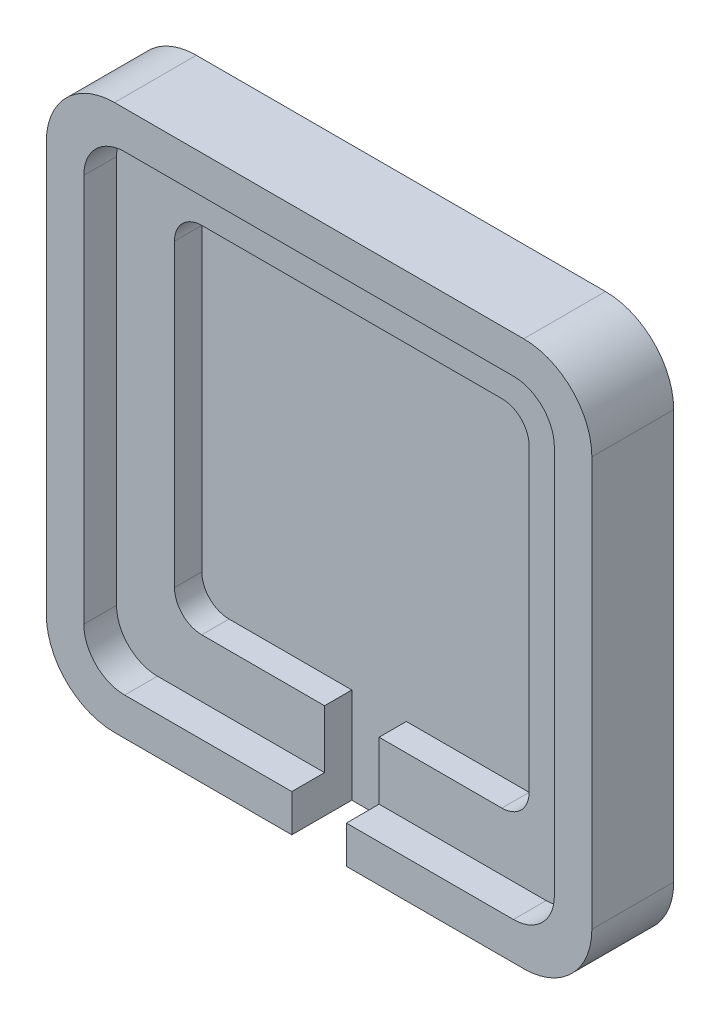
ISO-10303-21;
HEADER;
FILE_DESCRIPTION(('STEP AP214'),'2;1');
FILE_NAME('part.step','',(''),(''),'','','');
FILE_SCHEMA(('AUTOMOTIVE_DESIGN { 1 0 10303 214 1 1 1 1 }'));
ENDSEC;
DATA;
#1=APPLICATION_CONTEXT('core data for automotive mechanical design processes');
#2=APPLICATION_PROTOCOL_DEFINITION('international standard','automotive_design',2000,#1);
#3=PRODUCT_CONTEXT('',#1,'mechanical');
#4=PRODUCT('Part','Part','',(#3));
#5=PRODUCT_RELATED_PRODUCT_CATEGORY('part','',(#4));
#6=PRODUCT_DEFINITION_FORMATION('','',#4);
#7=PRODUCT_DEFINITION_CONTEXT('part definition',#1,'design');
#8=PRODUCT_DEFINITION('design','',#6,#7);
#9=PRODUCT_DEFINITION_SHAPE('','',#8);
#10=(LENGTH_UNIT() NAMED_UNIT(*) SI_UNIT(.MILLI.,.METRE.));
#11=(NAMED_UNIT(*) PLANE_ANGLE_UNIT() SI_UNIT($,.RADIAN.));
#12=(NAMED_UNIT(*) SI_UNIT($,.STERADIAN.) SOLID_ANGLE_UNIT());
#13=UNCERTAINTY_MEASURE_WITH_UNIT(LENGTH_MEASURE(1.E-05),#10,'distance_accuracy_value','');
#14=(GEOMETRIC_REPRESENTATION_CONTEXT(3) GLOBAL_UNCERTAINTY_ASSIGNED_CONTEXT((#13)) GLOBAL_UNIT_ASSIGNED_CONTEXT((#10,
#11,#12)) REPRESENTATION_CONTEXT('',''));
#15=CARTESIAN_POINT('',(0.,0.,0.));
#16=DIRECTION('',(0.,0.,1.));
#17=DIRECTION('',(1.,0.,0.));
#18=AXIS2_PLACEMENT_3D('',#15,#16,#17);
#19=CARTESIAN_POINT('',(17.25,-17.25,3.6));
#20=DIRECTION('',(0.,-1.,0.));
#21=DIRECTION('',(1.,0.,0.));
#22=AXIS2_PLACEMENT_3D('',#19,#20,#21);
#23=PLANE('',#22);
#24=DIRECTION('',(1.,0.,0.));
#25=VECTOR('',#24,1.);
#26=CARTESIAN_POINT('',(17.25,-17.25,3.6));
#27=LINE('',#26,#25);
#28=CARTESIAN_POINT('',(2.,-17.25,3.6));
#29=VERTEX_POINT('',#28);
#30=CARTESIAN_POINT('',(14.25,-17.25,3.6));
#31=VERTEX_POINT('',#30);
#32=EDGE_CURVE('E285',#29,#31,#27,.T.);
#33=ORIENTED_EDGE('',*,*,#32,.F.);
#34=DIRECTION('',(0.,0.,1.));
#35=VECTOR('',#34,1.);
#36=CARTESIAN_POINT('',(2.,-17.25,3.6));
#37=LINE('',#36,#35);
#38=CARTESIAN_POINT('',(2.,-17.25,6.));
#39=VERTEX_POINT('',#38);
#40=EDGE_CURVE('E258',#29,#39,#37,.T.);
#41=ORIENTED_EDGE('',*,*,#40,.T.);
#42=DIRECTION('',(1.,0.,0.));
#43=VECTOR('',#42,1.);
#44=CARTESIAN_POINT('',(17.25,-17.25,6.));
#45=LINE('',#44,#43);
#46=CARTESIAN_POINT('',(14.25,-17.25,6.));
#47=VERTEX_POINT('',#46);
#48=EDGE_CURVE('E299',#39,#47,#45,.T.);
#49=ORIENTED_EDGE('',*,*,#48,.T.);
#50=DIRECTION('',(0.,0.,1.));
#51=VECTOR('',#50,1.);
#52=CARTESIAN_POINT('',(14.25,-17.25,3.6));
#53=LINE('',#52,#51);
#54=EDGE_CURVE('E389',#47,#31,#53,.F.);
#55=ORIENTED_EDGE('',*,*,#54,.T.);
#56=EDGE_LOOP('',(#33,#41,#49,#55));
#57=FACE_BOUND('',#56,.T.);
#58=ADVANCED_FACE('F33',(#57),#23,.F.);
#59=CARTESIAN_POINT('',(-13.,-13.,1.6));
#60=DIRECTION('',(0.,-1.,0.));
#61=DIRECTION('',(0.,0.,-1.));
#62=AXIS2_PLACEMENT_3D('',#59,#60,#61);
#63=PLANE('',#62);
#64=DIRECTION('',(1.,0.,0.));
#65=VECTOR('',#64,1.);
#66=CARTESIAN_POINT('',(-13.,-13.,1.6));
#67=LINE('',#66,#65);
#68=CARTESIAN_POINT('',(2.,-13.,1.6));
#69=VERTEX_POINT('',#68);
#70=CARTESIAN_POINT('',(11.,-13.,1.6));
#71=VERTEX_POINT('',#70);
#72=EDGE_CURVE('E272',#69,#71,#67,.T.);
#73=ORIENTED_EDGE('',*,*,#72,.F.);
#74=DIRECTION('',(0.,0.,1.));
#75=VECTOR('',#74,1.);
#76=CARTESIAN_POINT('',(2.,-13.,1.6));
#77=LINE('',#76,#75);
#78=CARTESIAN_POINT('',(2.,-13.,3.6));
#79=VERTEX_POINT('',#78);
#80=EDGE_CURVE('E235',#69,#79,#77,.T.);
#81=ORIENTED_EDGE('',*,*,#80,.T.);
#82=DIRECTION('',(1.,0.,0.));
#83=VECTOR('',#82,1.);
#84=CARTESIAN_POINT('',(-13.,-13.,3.6));
#85=LINE('',#84,#83);
#86=CARTESIAN_POINT('',(11.,-13.,3.6));
#87=VERTEX_POINT('',#86);
#88=EDGE_CURVE('E279',#79,#87,#85,.T.);
#89=ORIENTED_EDGE('',*,*,#88,.T.);
#90=DIRECTION('',(0.,0.,1.));
#91=VECTOR('',#90,1.);
#92=CARTESIAN_POINT('',(11.,-13.,1.6));
#93=LINE('',#92,#91);
#94=EDGE_CURVE('E414',#87,#71,#93,.F.);
#95=ORIENTED_EDGE('',*,*,#94,.T.);
#96=EDGE_LOOP('',(#73,#81,#89,#95));
#97=FACE_BOUND('',#96,.T.);
#98=ADVANCED_FACE('F513',(#97),#63,.F.);
#99=CARTESIAN_POINT('',(-20.,-20.,6.));
#100=DIRECTION('',(1.,0.,0.));
#101=DIRECTION('',(0.,0.,-1.));
#102=AXIS2_PLACEMENT_3D('',#99,#100,#101);
#103=PLANE('',#102);
#104=DIRECTION('',(0.,-1.,0.));
#105=VECTOR('',#104,1.);
#106=CARTESIAN_POINT('',(-20.,-20.,0.));
#107=LINE('',#106,#105);
#108=CARTESIAN_POINT('',(-20.,15.,0.));
#109=VERTEX_POINT('',#108);
#110=CARTESIAN_POINT('',(-20.,-15.,0.));
#111=VERTEX_POINT('',#110);
#112=EDGE_CURVE('E296',#109,#111,#107,.T.);
#113=ORIENTED_EDGE('',*,*,#112,.T.);
#114=DIRECTION('',(0.,0.,-1.));
#115=VECTOR('',#114,1.);
#116=CARTESIAN_POINT('',(-20.,-15.,6.));
#117=LINE('',#116,#115);
#118=CARTESIAN_POINT('',(-20.,-15.,6.));
#119=VERTEX_POINT('',#118);
#120=EDGE_CURVE('E348',#111,#119,#117,.F.);
#121=ORIENTED_EDGE('',*,*,#120,.T.);
#122=DIRECTION('',(0.,-1.,0.));
#123=VECTOR('',#122,1.);
#124=CARTESIAN_POINT('',(-20.,-20.,6.));
#125=LINE('',#124,#123);
#126=CARTESIAN_POINT('',(-20.,15.,6.));
#127=VERTEX_POINT('',#126);
#128=EDGE_CURVE('E308',#127,#119,#125,.T.);
#129=ORIENTED_EDGE('',*,*,#128,.F.);
#130=DIRECTION('',(0.,0.,-1.));
#131=VECTOR('',#130,1.);
#132=CARTESIAN_POINT('',(-20.,15.,6.));
#133=LINE('',#132,#131);
#134=EDGE_CURVE('E345',#127,#109,#133,.T.);
#135=ORIENTED_EDGE('',*,*,#134,.T.);
#136=EDGE_LOOP('',(#113,#121,#129,#135));
#137=FACE_BOUND('',#136,.T.);
#138=ADVANCED_FACE('F547',(#137),#103,.F.);
#139=CARTESIAN_POINT('',(20.,-20.,6.));
#140=DIRECTION('',(0.,1.,0.));
#141=DIRECTION('',(-1.,0.,0.));
#142=AXIS2_PLACEMENT_3D('',#139,#140,#141);
#143=PLANE('',#142);
#144=DIRECTION('',(1.,0.,0.));
#145=VECTOR('',#144,1.);
#146=CARTESIAN_POINT('',(20.,-20.,6.));
#147=LINE('',#146,#145);
#148=CARTESIAN_POINT('',(2.,-20.,6.));
#149=VERTEX_POINT('',#148);
#150=CARTESIAN_POINT('',(15.,-20.,6.));
#151=VERTEX_POINT('',#150);
#152=EDGE_CURVE('E311',#149,#151,#147,.T.);
#153=ORIENTED_EDGE('',*,*,#152,.F.);
#154=DIRECTION('',(0.,0.,-1.));
#155=VECTOR('',#154,1.);
#156=CARTESIAN_POINT('',(2.,-20.,6.));
#157=LINE('',#156,#155);
#158=CARTESIAN_POINT('',(2.,-20.,1.6));
#159=VERTEX_POINT('',#158);
#160=EDGE_CURVE('E252',#149,#159,#157,.T.);
#161=ORIENTED_EDGE('',*,*,#160,.T.);
#162=DIRECTION('',(-1.,0.,0.));
#163=VECTOR('',#162,1.);
#164=CARTESIAN_POINT('',(20.,-20.,1.6));
#165=LINE('',#164,#163);
#166=CARTESIAN_POINT('',(-2.,-20.,1.6));
#167=VERTEX_POINT('',#166);
#168=EDGE_CURVE('E242',#159,#167,#165,.T.);
#169=ORIENTED_EDGE('',*,*,#168,.T.);
#170=DIRECTION('',(0.,0.,1.));
#171=VECTOR('',#170,1.);
#172=CARTESIAN_POINT('',(-2.,-20.,6.));
#173=LINE('',#172,#171);
#174=CARTESIAN_POINT('',(-2.,-20.,6.));
#175=VERTEX_POINT('',#174);
#176=EDGE_CURVE('E227',#167,#175,#173,.T.);
#177=ORIENTED_EDGE('',*,*,#176,.T.);
#178=CARTESIAN_POINT('',(-15.,-20.,6.));
#179=VERTEX_POINT('',#178);
#180=EDGE_CURVE('E313',#179,#175,#147,.T.);
#181=ORIENTED_EDGE('',*,*,#180,.F.);
#182=DIRECTION('',(0.,0.,-1.));
#183=VECTOR('',#182,1.);
#184=CARTESIAN_POINT('',(-15.,-20.,6.));
#185=LINE('',#184,#183);
#186=CARTESIAN_POINT('',(-15.,-20.,0.));
#187=VERTEX_POINT('',#186);
#188=EDGE_CURVE('E334',#179,#187,#185,.T.);
#189=ORIENTED_EDGE('',*,*,#188,.T.);
#190=DIRECTION('',(1.,0.,0.));
#191=VECTOR('',#190,1.);
#192=CARTESIAN_POINT('',(20.,-20.,0.));
#193=LINE('',#192,#191);
#194=CARTESIAN_POINT('',(15.,-20.,0.));
#195=VERTEX_POINT('',#194);
#196=EDGE_CURVE('E324',#187,#195,#193,.T.);
#197=ORIENTED_EDGE('',*,*,#196,.T.);
#198=DIRECTION('',(0.,0.,-1.));
#199=VECTOR('',#198,1.);
#200=CARTESIAN_POINT('',(15.,-20.,6.));
#201=LINE('',#200,#199);
#202=EDGE_CURVE('E321',#195,#151,#201,.F.);
#203=ORIENTED_EDGE('',*,*,#202,.T.);
#204=EDGE_LOOP('',(#153,#161,#169,#177,#181,#189,#197,#203));
#205=FACE_BOUND('',#204,.T.);
#206=ADVANCED_FACE('F251',(#205),#143,.F.);
#207=CARTESIAN_POINT('',(20.,-20.,6.));
#208=DIRECTION('',(-1.,0.,0.));
#209=DIRECTION('',(0.,0.,1.));
#210=AXIS2_PLACEMENT_3D('',#207,#208,#209);
#211=PLANE('',#210);
#212=DIRECTION('',(0.,1.,0.));
#213=VECTOR('',#212,1.);
#214=CARTESIAN_POINT('',(20.,-20.,0.));
#215=LINE('',#214,#213);
#216=CARTESIAN_POINT('',(20.,-15.,0.));
#217=VERTEX_POINT('',#216);
#218=CARTESIAN_POINT('',(20.,15.,0.));
#219=VERTEX_POINT('',#218);
#220=EDGE_CURVE('E327',#217,#219,#215,.T.);
#221=ORIENTED_EDGE('',*,*,#220,.T.);
#222=DIRECTION('',(0.,0.,-1.));
#223=VECTOR('',#222,1.);
#224=CARTESIAN_POINT('',(20.,15.,6.));
#225=LINE('',#224,#223);
#226=CARTESIAN_POINT('',(20.,15.,6.));
#227=VERTEX_POINT('',#226);
#228=EDGE_CURVE('E366',#219,#227,#225,.F.);
#229=ORIENTED_EDGE('',*,*,#228,.T.);
#230=DIRECTION('',(0.,1.,0.));
#231=VECTOR('',#230,1.);
#232=CARTESIAN_POINT('',(20.,-20.,6.));
#233=LINE('',#232,#231);
#234=CARTESIAN_POINT('',(20.,-15.,6.));
#235=VERTEX_POINT('',#234);
#236=EDGE_CURVE('E315',#235,#227,#233,.T.);
#237=ORIENTED_EDGE('',*,*,#236,.F.);
#238=DIRECTION('',(0.,0.,-1.));
#239=VECTOR('',#238,1.);
#240=CARTESIAN_POINT('',(20.,-15.,6.));
#241=LINE('',#240,#239);
#242=EDGE_CURVE('E363',#235,#217,#241,.T.);
#243=ORIENTED_EDGE('',*,*,#242,.T.);
#244=EDGE_LOOP('',(#221,#229,#237,#243));
#245=FACE_BOUND('',#244,.T.);
#246=ADVANCED_FACE('F609',(#245),#211,.F.);
#247=CARTESIAN_POINT('',(20.,20.,6.));
#248=DIRECTION('',(0.,-1.,0.));
#249=DIRECTION('',(1.,0.,0.));
#250=AXIS2_PLACEMENT_3D('',#247,#248,#249);
#251=PLANE('',#250);
#252=DIRECTION('',(-1.,0.,0.));
#253=VECTOR('',#252,1.);
#254=CARTESIAN_POINT('',(20.,20.,0.));
#255=LINE('',#254,#253);
#256=CARTESIAN_POINT('',(15.,20.,0.));
#257=VERTEX_POINT('',#256);
#258=CARTESIAN_POINT('',(-15.,20.,0.));
#259=VERTEX_POINT('',#258);
#260=EDGE_CURVE('E312',#257,#259,#255,.T.);
#261=ORIENTED_EDGE('',*,*,#260,.T.);
#262=DIRECTION('',(0.,0.,-1.));
#263=VECTOR('',#262,1.);
#264=CARTESIAN_POINT('',(-15.,20.,6.));
#265=LINE('',#264,#263);
#266=CARTESIAN_POINT('',(-15.,20.,6.));
#267=VERTEX_POINT('',#266);
#268=EDGE_CURVE('E361',#259,#267,#265,.F.);
#269=ORIENTED_EDGE('',*,*,#268,.T.);
#270=DIRECTION('',(-1.,0.,0.));
#271=VECTOR('',#270,1.);
#272=CARTESIAN_POINT('',(20.,20.,6.));
#273=LINE('',#272,#271);
#274=CARTESIAN_POINT('',(15.,20.,6.));
#275=VERTEX_POINT('',#274);
#276=EDGE_CURVE('E318',#275,#267,#273,.T.);
#277=ORIENTED_EDGE('',*,*,#276,.F.);
#278=DIRECTION('',(0.,0.,-1.));
#279=VECTOR('',#278,1.);
#280=CARTESIAN_POINT('',(15.,20.,6.));
#281=LINE('',#280,#279);
#282=EDGE_CURVE('E358',#275,#257,#281,.T.);
#283=ORIENTED_EDGE('',*,*,#282,.T.);
#284=EDGE_LOOP('',(#261,#269,#277,#283));
#285=FACE_BOUND('',#284,.T.);
#286=ADVANCED_FACE('F621',(#285),#251,.F.);
#287=CARTESIAN_POINT('',(0.,0.,6.));
#288=DIRECTION('',(0.,0.,1.));
#289=DIRECTION('',(1.,0.,0.));
#290=AXIS2_PLACEMENT_3D('',#287,#288,#289);
#291=PLANE('',#290);
#292=DIRECTION('',(0.,1.,0.));
#293=VECTOR('',#292,1.);
#294=CARTESIAN_POINT('',(2.,-12.27750489836,6.));
#295=LINE('',#294,#293);
#296=EDGE_CURVE('E472',#149,#39,#295,.T.);
#297=ORIENTED_EDGE('',*,*,#296,.F.);
#298=ORIENTED_EDGE('',*,*,#152,.T.);
#299=CARTESIAN_POINT('',(15.,-15.,6.));
#300=DIRECTION('',(0.,0.,1.));
#301=DIRECTION('',(1.,0.,0.));
#302=AXIS2_PLACEMENT_3D('',#299,#300,#301);
#303=CIRCLE('',#302,5.);
#304=EDGE_CURVE('E350',#151,#235,#303,.T.);
#305=ORIENTED_EDGE('',*,*,#304,.T.);
#306=ORIENTED_EDGE('',*,*,#236,.T.);
#307=CARTESIAN_POINT('',(15.,15.,6.));
#308=DIRECTION('',(0.,0.,1.));
#309=DIRECTION('',(1.,0.,0.));
#310=AXIS2_PLACEMENT_3D('',#307,#308,#309);
#311=CIRCLE('',#310,5.);
#312=EDGE_CURVE('E352',#227,#275,#311,.T.);
#313=ORIENTED_EDGE('',*,*,#312,.T.);
#314=ORIENTED_EDGE('',*,*,#276,.T.);
#315=CARTESIAN_POINT('',(-15.,15.,6.));
#316=DIRECTION('',(0.,0.,1.));
#317=DIRECTION('',(1.,0.,0.));
#318=AXIS2_PLACEMENT_3D('',#315,#316,#317);
#319=CIRCLE('',#318,5.);
#320=EDGE_CURVE('E354',#267,#127,#319,.T.);
#321=ORIENTED_EDGE('',*,*,#320,.T.);
#322=ORIENTED_EDGE('',*,*,#128,.T.);
#323=CARTESIAN_POINT('',(-15.,-15.,6.));
#324=DIRECTION('',(0.,0.,1.));
#325=DIRECTION('',(1.,0.,0.));
#326=AXIS2_PLACEMENT_3D('',#323,#324,#325);
#327=CIRCLE('',#326,5.);
#328=EDGE_CURVE('E356',#119,#179,#327,.T.);
#329=ORIENTED_EDGE('',*,*,#328,.T.);
#330=ORIENTED_EDGE('',*,*,#180,.T.);
#331=DIRECTION('',(0.,-1.,0.));
#332=VECTOR('',#331,1.);
#333=CARTESIAN_POINT('',(-2.,-12.27750489836,6.));
#334=LINE('',#333,#332);
#335=CARTESIAN_POINT('',(-2.,-17.25,6.));
#336=VERTEX_POINT('',#335);
#337=EDGE_CURVE('E230',#336,#175,#334,.T.);
#338=ORIENTED_EDGE('',*,*,#337,.F.);
#339=CARTESIAN_POINT('',(-14.25,-17.25,6.));
#340=VERTEX_POINT('',#339);
#341=EDGE_CURVE('E300',#340,#336,#45,.T.);
#342=ORIENTED_EDGE('',*,*,#341,.F.);
#343=CARTESIAN_POINT('',(-14.25,-14.25,6.));
#344=DIRECTION('',(0.,0.,1.));
#345=DIRECTION('',(1.,0.,0.));
#346=AXIS2_PLACEMENT_3D('',#343,#344,#345);
#347=CIRCLE('',#346,3.);
#348=CARTESIAN_POINT('',(-17.25,-14.25,6.));
#349=VERTEX_POINT('',#348);
#350=EDGE_CURVE('E402',#340,#349,#347,.F.);
#351=ORIENTED_EDGE('',*,*,#350,.T.);
#352=DIRECTION('',(0.,-1.,0.));
#353=VECTOR('',#352,1.);
#354=CARTESIAN_POINT('',(-17.25,-17.25,6.));
#355=LINE('',#354,#353);
#356=CARTESIAN_POINT('',(-17.25,14.25,6.));
#357=VERTEX_POINT('',#356);
#358=EDGE_CURVE('E273',#357,#349,#355,.T.);
#359=ORIENTED_EDGE('',*,*,#358,.F.);
#360=CARTESIAN_POINT('',(-14.25,14.25,6.));
#361=DIRECTION('',(0.,0.,1.));
#362=DIRECTION('',(1.,0.,0.));
#363=AXIS2_PLACEMENT_3D('',#360,#361,#362);
#364=CIRCLE('',#363,3.);
#365=CARTESIAN_POINT('',(-14.25,17.25,6.));
#366=VERTEX_POINT('',#365);
#367=EDGE_CURVE('E404',#357,#366,#364,.F.);
#368=ORIENTED_EDGE('',*,*,#367,.T.);
#369=DIRECTION('',(-1.,0.,0.));
#370=VECTOR('',#369,1.);
#371=CARTESIAN_POINT('',(17.25,17.25,6.));
#372=LINE('',#371,#370);
#373=CARTESIAN_POINT('',(14.25,17.25,6.));
#374=VERTEX_POINT('',#373);
#375=EDGE_CURVE('E286',#374,#366,#372,.T.);
#376=ORIENTED_EDGE('',*,*,#375,.F.);
#377=CARTESIAN_POINT('',(14.25,14.25,6.));
#378=DIRECTION('',(0.,0.,1.));
#379=DIRECTION('',(1.,0.,0.));
#380=AXIS2_PLACEMENT_3D('',#377,#378,#379);
#381=CIRCLE('',#380,3.);
#382=CARTESIAN_POINT('',(17.25,14.25,6.));
#383=VERTEX_POINT('',#382);
#384=EDGE_CURVE('E397',#374,#383,#381,.F.);
#385=ORIENTED_EDGE('',*,*,#384,.T.);
#386=DIRECTION('',(0.,1.,0.));
#387=VECTOR('',#386,1.);
#388=CARTESIAN_POINT('',(17.25,-17.25,6.));
#389=LINE('',#388,#387);
#390=CARTESIAN_POINT('',(17.25,-14.25,6.));
#391=VERTEX_POINT('',#390);
#392=EDGE_CURVE('E303',#391,#383,#389,.T.);
#393=ORIENTED_EDGE('',*,*,#392,.F.);
#394=CARTESIAN_POINT('',(14.25,-14.25,6.));
#395=DIRECTION('',(0.,0.,1.));
#396=DIRECTION('',(1.,0.,0.));
#397=AXIS2_PLACEMENT_3D('',#394,#395,#396);
#398=CIRCLE('',#397,3.);
#399=EDGE_CURVE('E399',#391,#47,#398,.F.);
#400=ORIENTED_EDGE('',*,*,#399,.T.);
#401=ORIENTED_EDGE('',*,*,#48,.F.);
#402=EDGE_LOOP('',(#297,#298,#305,#306,#313,#314,#321,#322,#329,#330,#338,#342,#351,#359,#368,
#376,#385,#393,#400,#401));
#403=FACE_BOUND('',#402,.T.);
#404=ADVANCED_FACE('F471',(#403),#291,.T.);
#405=CARTESIAN_POINT('',(0.,0.,0.));
#406=DIRECTION('',(0.,0.,1.));
#407=DIRECTION('',(1.,0.,0.));
#408=AXIS2_PLACEMENT_3D('',#405,#406,#407);
#409=PLANE('',#408);
#410=ORIENTED_EDGE('',*,*,#196,.F.);
#411=CARTESIAN_POINT('',(-15.,-15.,0.));
#412=DIRECTION('',(0.,0.,1.));
#413=DIRECTION('',(1.,0.,0.));
#414=AXIS2_PLACEMENT_3D('',#411,#412,#413);
#415=CIRCLE('',#414,5.);
#416=EDGE_CURVE('E343',#187,#111,#415,.F.);
#417=ORIENTED_EDGE('',*,*,#416,.T.);
#418=ORIENTED_EDGE('',*,*,#112,.F.);
#419=CARTESIAN_POINT('',(-15.,15.,0.));
#420=DIRECTION('',(0.,0.,1.));
#421=DIRECTION('',(1.,0.,0.));
#422=AXIS2_PLACEMENT_3D('',#419,#420,#421);
#423=CIRCLE('',#422,5.);
#424=EDGE_CURVE('E341',#109,#259,#423,.F.);
#425=ORIENTED_EDGE('',*,*,#424,.T.);
#426=ORIENTED_EDGE('',*,*,#260,.F.);
#427=CARTESIAN_POINT('',(15.,15.,0.));
#428=DIRECTION('',(0.,0.,1.));
#429=DIRECTION('',(1.,0.,0.));
#430=AXIS2_PLACEMENT_3D('',#427,#428,#429);
#431=CIRCLE('',#430,5.);
#432=EDGE_CURVE('E339',#257,#219,#431,.F.);
#433=ORIENTED_EDGE('',*,*,#432,.T.);
#434=ORIENTED_EDGE('',*,*,#220,.F.);
#435=CARTESIAN_POINT('',(15.,-15.,0.));
#436=DIRECTION('',(0.,0.,1.));
#437=DIRECTION('',(1.,0.,0.));
#438=AXIS2_PLACEMENT_3D('',#435,#436,#437);
#439=CIRCLE('',#438,5.);
#440=EDGE_CURVE('E337',#217,#195,#439,.F.);
#441=ORIENTED_EDGE('',*,*,#440,.T.);
#442=EDGE_LOOP('',(#410,#417,#418,#425,#426,#433,#434,#441));
#443=FACE_BOUND('',#442,.T.);
#444=ADVANCED_FACE('F620',(#443),#409,.F.);
#445=CARTESIAN_POINT('',(-15.,-15.,6.));
#446=DIRECTION('',(0.,0.,-1.));
#447=DIRECTION('',(-1.,0.,0.));
#448=AXIS2_PLACEMENT_3D('',#445,#446,#447);
#449=CYLINDRICAL_SURFACE('',#448,5.);
#450=ORIENTED_EDGE('',*,*,#328,.F.);
#451=ORIENTED_EDGE('',*,*,#120,.F.);
#452=ORIENTED_EDGE('',*,*,#416,.F.);
#453=ORIENTED_EDGE('',*,*,#188,.F.);
#454=EDGE_LOOP('',(#450,#451,#452,#453));
#455=FACE_BOUND('',#454,.T.);
#456=ADVANCED_FACE('F761',(#455),#449,.T.);
#457=CARTESIAN_POINT('',(-15.,15.,6.));
#458=DIRECTION('',(0.,0.,-1.));
#459=DIRECTION('',(-1.,0.,0.));
#460=AXIS2_PLACEMENT_3D('',#457,#458,#459);
#461=CYLINDRICAL_SURFACE('',#460,5.);
#462=ORIENTED_EDGE('',*,*,#320,.F.);
#463=ORIENTED_EDGE('',*,*,#268,.F.);
#464=ORIENTED_EDGE('',*,*,#424,.F.);
#465=ORIENTED_EDGE('',*,*,#134,.F.);
#466=EDGE_LOOP('',(#462,#463,#464,#465));
#467=FACE_BOUND('',#466,.T.);
#468=ADVANCED_FACE('F751',(#467),#461,.T.);
#469=CARTESIAN_POINT('',(15.,15.,6.));
#470=DIRECTION('',(0.,0.,-1.));
#471=DIRECTION('',(-1.,0.,0.));
#472=AXIS2_PLACEMENT_3D('',#469,#470,#471);
#473=CYLINDRICAL_SURFACE('',#472,5.);
#474=ORIENTED_EDGE('',*,*,#312,.F.);
#475=ORIENTED_EDGE('',*,*,#228,.F.);
#476=ORIENTED_EDGE('',*,*,#432,.F.);
#477=ORIENTED_EDGE('',*,*,#282,.F.);
#478=EDGE_LOOP('',(#474,#475,#476,#477));
#479=FACE_BOUND('',#478,.T.);
#480=ADVANCED_FACE('F741',(#479),#473,.T.);
#481=CARTESIAN_POINT('',(15.,-15.,6.));
#482=DIRECTION('',(0.,0.,-1.));
#483=DIRECTION('',(-1.,0.,0.));
#484=AXIS2_PLACEMENT_3D('',#481,#482,#483);
#485=CYLINDRICAL_SURFACE('',#484,5.);
#486=ORIENTED_EDGE('',*,*,#304,.F.);
#487=ORIENTED_EDGE('',*,*,#202,.F.);
#488=ORIENTED_EDGE('',*,*,#440,.F.);
#489=ORIENTED_EDGE('',*,*,#242,.F.);
#490=EDGE_LOOP('',(#486,#487,#488,#489));
#491=FACE_BOUND('',#490,.T.);
#492=ADVANCED_FACE('F733',(#491),#485,.T.);
#493=CARTESIAN_POINT('',(-17.25,-17.25,3.6));
#494=DIRECTION('',(-1.,0.,0.));
#495=DIRECTION('',(0.,0.,1.));
#496=AXIS2_PLACEMENT_3D('',#493,#494,#495);
#497=PLANE('',#496);
#498=ORIENTED_EDGE('',*,*,#358,.T.);
#499=DIRECTION('',(0.,0.,1.));
#500=VECTOR('',#499,1.);
#501=CARTESIAN_POINT('',(-17.25,-14.25,3.6));
#502=LINE('',#501,#500);
#503=CARTESIAN_POINT('',(-17.25,-14.25,3.6));
#504=VERTEX_POINT('',#503);
#505=EDGE_CURVE('E395',#349,#504,#502,.F.);
#506=ORIENTED_EDGE('',*,*,#505,.T.);
#507=DIRECTION('',(0.,-1.,0.));
#508=VECTOR('',#507,1.);
#509=CARTESIAN_POINT('',(-17.25,-17.25,3.6));
#510=LINE('',#509,#508);
#511=CARTESIAN_POINT('',(-17.25,14.25,3.6));
#512=VERTEX_POINT('',#511);
#513=EDGE_CURVE('E282',#512,#504,#510,.T.);
#514=ORIENTED_EDGE('',*,*,#513,.F.);
#515=DIRECTION('',(0.,0.,1.));
#516=VECTOR('',#515,1.);
#517=CARTESIAN_POINT('',(-17.25,14.25,6.));
#518=LINE('',#517,#516);
#519=EDGE_CURVE('E392',#512,#357,#518,.T.);
#520=ORIENTED_EDGE('',*,*,#519,.T.);
#521=EDGE_LOOP('',(#498,#506,#514,#520));
#522=FACE_BOUND('',#521,.T.);
#523=ADVANCED_FACE('F499',(#522),#497,.F.);
#524=CARTESIAN_POINT('',(17.25,17.25,3.6));
#525=DIRECTION('',(0.,1.,0.));
#526=DIRECTION('',(-1.,0.,0.));
#527=AXIS2_PLACEMENT_3D('',#524,#525,#526);
#528=PLANE('',#527);
#529=DIRECTION('',(-1.,0.,0.));
#530=VECTOR('',#529,1.);
#531=CARTESIAN_POINT('',(17.25,17.25,3.6));
#532=LINE('',#531,#530);
#533=CARTESIAN_POINT('',(14.25,17.25,3.6));
#534=VERTEX_POINT('',#533);
#535=CARTESIAN_POINT('',(-14.25,17.25,3.6));
#536=VERTEX_POINT('',#535);
#537=EDGE_CURVE('E293',#534,#536,#532,.T.);
#538=ORIENTED_EDGE('',*,*,#537,.F.);
#539=DIRECTION('',(0.,0.,1.));
#540=VECTOR('',#539,1.);
#541=CARTESIAN_POINT('',(14.25,17.25,6.));
#542=LINE('',#541,#540);
#543=EDGE_CURVE('E370',#534,#374,#542,.T.);
#544=ORIENTED_EDGE('',*,*,#543,.T.);
#545=ORIENTED_EDGE('',*,*,#375,.T.);
#546=DIRECTION('',(0.,0.,1.));
#547=VECTOR('',#546,1.);
#548=CARTESIAN_POINT('',(-14.25,17.25,3.6));
#549=LINE('',#548,#547);
#550=EDGE_CURVE('E368',#366,#536,#549,.F.);
#551=ORIENTED_EDGE('',*,*,#550,.T.);
#552=EDGE_LOOP('',(#538,#544,#545,#551));
#553=FACE_BOUND('',#552,.T.);
#554=ADVANCED_FACE('F490',(#553),#528,.F.);
#555=CARTESIAN_POINT('',(17.25,-17.25,3.6));
#556=DIRECTION('',(1.,0.,0.));
#557=DIRECTION('',(0.,0.,-1.));
#558=AXIS2_PLACEMENT_3D('',#555,#556,#557);
#559=PLANE('',#558);
#560=ORIENTED_EDGE('',*,*,#392,.T.);
#561=DIRECTION('',(0.,0.,1.));
#562=VECTOR('',#561,1.);
#563=CARTESIAN_POINT('',(17.25,14.25,3.6));
#564=LINE('',#563,#562);
#565=CARTESIAN_POINT('',(17.25,14.25,3.6));
#566=VERTEX_POINT('',#565);
#567=EDGE_CURVE('E376',#383,#566,#564,.F.);
#568=ORIENTED_EDGE('',*,*,#567,.T.);
#569=DIRECTION('',(0.,1.,0.));
#570=VECTOR('',#569,1.);
#571=CARTESIAN_POINT('',(17.25,-17.25,3.6));
#572=LINE('',#571,#570);
#573=CARTESIAN_POINT('',(17.25,-14.25,3.6));
#574=VERTEX_POINT('',#573);
#575=EDGE_CURVE('E290',#574,#566,#572,.T.);
#576=ORIENTED_EDGE('',*,*,#575,.F.);
#577=DIRECTION('',(0.,0.,1.));
#578=VECTOR('',#577,1.);
#579=CARTESIAN_POINT('',(17.25,-14.25,6.));
#580=LINE('',#579,#578);
#581=EDGE_CURVE('E373',#574,#391,#580,.T.);
#582=ORIENTED_EDGE('',*,*,#581,.T.);
#583=EDGE_LOOP('',(#560,#568,#576,#582));
#584=FACE_BOUND('',#583,.T.);
#585=ADVANCED_FACE('F482',(#584),#559,.F.);
#586=ORIENTED_EDGE('',*,*,#341,.T.);
#587=DIRECTION('',(0.,0.,-1.));
#588=VECTOR('',#587,1.);
#589=CARTESIAN_POINT('',(-2.,-17.25,3.6));
#590=LINE('',#589,#588);
#591=CARTESIAN_POINT('',(-2.,-17.25,3.6));
#592=VERTEX_POINT('',#591);
#593=EDGE_CURVE('E236',#336,#592,#590,.T.);
#594=ORIENTED_EDGE('',*,*,#593,.T.);
#595=CARTESIAN_POINT('',(-14.25,-17.25,3.6));
#596=VERTEX_POINT('',#595);
#597=EDGE_CURVE('E287',#596,#592,#27,.T.);
#598=ORIENTED_EDGE('',*,*,#597,.F.);
#599=DIRECTION('',(0.,0.,1.));
#600=VECTOR('',#599,1.);
#601=CARTESIAN_POINT('',(-14.25,-17.25,6.));
#602=LINE('',#601,#600);
#603=EDGE_CURVE('E386',#596,#340,#602,.T.);
#604=ORIENTED_EDGE('',*,*,#603,.T.);
#605=EDGE_LOOP('',(#586,#594,#598,#604));
#606=FACE_BOUND('',#605,.T.);
#607=ADVANCED_FACE('F507',(#606),#23,.F.);
#608=CARTESIAN_POINT('',(0.,0.,3.6));
#609=DIRECTION('',(0.,0.,1.));
#610=DIRECTION('',(1.,0.,0.));
#611=AXIS2_PLACEMENT_3D('',#608,#609,#610);
#612=PLANE('',#611);
#613=DIRECTION('',(0.,1.,0.));
#614=VECTOR('',#613,1.);
#615=CARTESIAN_POINT('',(1.99999999999999,0.,3.6));
#616=LINE('',#615,#614);
#617=EDGE_CURVE('E463',#29,#79,#616,.T.);
#618=ORIENTED_EDGE('',*,*,#617,.F.);
#619=ORIENTED_EDGE('',*,*,#32,.T.);
#620=CARTESIAN_POINT('',(14.25,-14.25,3.6));
#621=DIRECTION('',(0.,0.,1.));
#622=DIRECTION('',(1.,0.,0.));
#623=AXIS2_PLACEMENT_3D('',#620,#621,#622);
#624=CIRCLE('',#623,3.);
#625=EDGE_CURVE('E382',#31,#574,#624,.T.);
#626=ORIENTED_EDGE('',*,*,#625,.T.);
#627=ORIENTED_EDGE('',*,*,#575,.T.);
#628=CARTESIAN_POINT('',(14.25,14.25,3.6));
#629=DIRECTION('',(0.,0.,1.));
#630=DIRECTION('',(1.,0.,0.));
#631=AXIS2_PLACEMENT_3D('',#628,#629,#630);
#632=CIRCLE('',#631,3.);
#633=EDGE_CURVE('E384',#566,#534,#632,.T.);
#634=ORIENTED_EDGE('',*,*,#633,.T.);
#635=ORIENTED_EDGE('',*,*,#537,.T.);
#636=CARTESIAN_POINT('',(-14.25,14.25,3.6));
#637=DIRECTION('',(0.,0.,1.));
#638=DIRECTION('',(1.,0.,0.));
#639=AXIS2_PLACEMENT_3D('',#636,#637,#638);
#640=CIRCLE('',#639,3.);
#641=EDGE_CURVE('E378',#536,#512,#640,.T.);
#642=ORIENTED_EDGE('',*,*,#641,.T.);
#643=ORIENTED_EDGE('',*,*,#513,.T.);
#644=CARTESIAN_POINT('',(-14.25,-14.25,3.6));
#645=DIRECTION('',(0.,0.,1.));
#646=DIRECTION('',(1.,0.,0.));
#647=AXIS2_PLACEMENT_3D('',#644,#645,#646);
#648=CIRCLE('',#647,3.);
#649=EDGE_CURVE('E380',#504,#596,#648,.T.);
#650=ORIENTED_EDGE('',*,*,#649,.T.);
#651=ORIENTED_EDGE('',*,*,#597,.T.);
#652=DIRECTION('',(0.,-1.,0.));
#653=VECTOR('',#652,1.);
#654=CARTESIAN_POINT('',(-2.,0.,3.6));
#655=LINE('',#654,#653);
#656=CARTESIAN_POINT('',(-2.,-13.,3.6));
#657=VERTEX_POINT('',#656);
#658=EDGE_CURVE('E454',#657,#592,#655,.T.);
#659=ORIENTED_EDGE('',*,*,#658,.F.);
#660=CARTESIAN_POINT('',(-11.,-13.,3.6));
#661=VERTEX_POINT('',#660);
#662=EDGE_CURVE('E266',#661,#657,#85,.T.);
#663=ORIENTED_EDGE('',*,*,#662,.F.);
#664=CARTESIAN_POINT('',(-11.,-11.,3.6));
#665=DIRECTION('',(0.,0.,1.));
#666=DIRECTION('',(1.,0.,0.));
#667=AXIS2_PLACEMENT_3D('',#664,#665,#666);
#668=CIRCLE('',#667,2.);
#669=CARTESIAN_POINT('',(-13.,-11.,3.6));
#670=VERTEX_POINT('',#669);
#671=EDGE_CURVE('E438',#661,#670,#668,.F.);
#672=ORIENTED_EDGE('',*,*,#671,.T.);
#673=DIRECTION('',(0.,-1.,0.));
#674=VECTOR('',#673,1.);
#675=CARTESIAN_POINT('',(-13.,-13.,3.6));
#676=LINE('',#675,#674);
#677=CARTESIAN_POINT('',(-13.,11.,3.6));
#678=VERTEX_POINT('',#677);
#679=EDGE_CURVE('E276',#678,#670,#676,.T.);
#680=ORIENTED_EDGE('',*,*,#679,.F.);
#681=CARTESIAN_POINT('',(-11.,11.,3.6));
#682=DIRECTION('',(0.,0.,1.));
#683=DIRECTION('',(1.,0.,0.));
#684=AXIS2_PLACEMENT_3D('',#681,#682,#683);
#685=CIRCLE('',#684,2.);
#686=CARTESIAN_POINT('',(-11.,13.,3.6));
#687=VERTEX_POINT('',#686);
#688=EDGE_CURVE('E41',#678,#687,#685,.F.);
#689=ORIENTED_EDGE('',*,*,#688,.T.);
#690=DIRECTION('',(-1.,0.,0.));
#691=VECTOR('',#690,1.);
#692=CARTESIAN_POINT('',(-13.,13.,3.6));
#693=LINE('',#692,#691);
#694=CARTESIAN_POINT('',(11.,13.,3.6));
#695=VERTEX_POINT('',#694);
#696=EDGE_CURVE('E256',#695,#687,#693,.T.);
#697=ORIENTED_EDGE('',*,*,#696,.F.);
#698=CARTESIAN_POINT('',(11.,11.,3.6));
#699=DIRECTION('',(0.,0.,1.));
#700=DIRECTION('',(1.,0.,0.));
#701=AXIS2_PLACEMENT_3D('',#698,#699,#700);
#702=CIRCLE('',#701,2.);
#703=CARTESIAN_POINT('',(13.,11.,3.6));
#704=VERTEX_POINT('',#703);
#705=EDGE_CURVE('E11',#695,#704,#702,.F.);
#706=ORIENTED_EDGE('',*,*,#705,.T.);
#707=DIRECTION('',(0.,1.,0.));
#708=VECTOR('',#707,1.);
#709=CARTESIAN_POINT('',(13.,-13.,3.6));
#710=LINE('',#709,#708);
#711=CARTESIAN_POINT('',(13.,-11.,3.6));
#712=VERTEX_POINT('',#711);
#713=EDGE_CURVE('E253',#712,#704,#710,.T.);
#714=ORIENTED_EDGE('',*,*,#713,.F.);
#715=CARTESIAN_POINT('',(11.,-11.,3.6));
#716=DIRECTION('',(0.,0.,1.));
#717=DIRECTION('',(1.,0.,0.));
#718=AXIS2_PLACEMENT_3D('',#715,#716,#717);
#719=CIRCLE('',#718,2.);
#720=EDGE_CURVE('E435',#712,#87,#719,.F.);
#721=ORIENTED_EDGE('',*,*,#720,.T.);
#722=ORIENTED_EDGE('',*,*,#88,.F.);
#723=EDGE_LOOP('',(#618,#619,#626,#627,#634,#635,#642,#643,#650,#651,#659,#663,#672,#680,#689,
#697,#706,#714,#721,#722));
#724=FACE_BOUND('',#723,.T.);
#725=ADVANCED_FACE('F441',(#724),#612,.T.);
#726=CARTESIAN_POINT('',(14.25,14.25,3.6));
#727=DIRECTION('',(0.,0.,-1.));
#728=DIRECTION('',(-1.,0.,0.));
#729=AXIS2_PLACEMENT_3D('',#726,#727,#728);
#730=CYLINDRICAL_SURFACE('',#729,3.);
#731=ORIENTED_EDGE('',*,*,#633,.F.);
#732=ORIENTED_EDGE('',*,*,#567,.F.);
#733=ORIENTED_EDGE('',*,*,#384,.F.);
#734=ORIENTED_EDGE('',*,*,#543,.F.);
#735=EDGE_LOOP('',(#731,#732,#733,#734));
#736=FACE_BOUND('',#735,.T.);
#737=ADVANCED_FACE('F485',(#736),#730,.F.);
#738=CARTESIAN_POINT('',(14.25,-14.25,3.6));
#739=DIRECTION('',(0.,0.,-1.));
#740=DIRECTION('',(-1.,0.,0.));
#741=AXIS2_PLACEMENT_3D('',#738,#739,#740);
#742=CYLINDRICAL_SURFACE('',#741,3.);
#743=ORIENTED_EDGE('',*,*,#625,.F.);
#744=ORIENTED_EDGE('',*,*,#54,.F.);
#745=ORIENTED_EDGE('',*,*,#399,.F.);
#746=ORIENTED_EDGE('',*,*,#581,.F.);
#747=EDGE_LOOP('',(#743,#744,#745,#746));
#748=FACE_BOUND('',#747,.T.);
#749=ADVANCED_FACE('F478',(#748),#742,.F.);
#750=CARTESIAN_POINT('',(-14.25,-14.25,3.6));
#751=DIRECTION('',(0.,0.,-1.));
#752=DIRECTION('',(-1.,0.,0.));
#753=AXIS2_PLACEMENT_3D('',#750,#751,#752);
#754=CYLINDRICAL_SURFACE('',#753,3.);
#755=ORIENTED_EDGE('',*,*,#649,.F.);
#756=ORIENTED_EDGE('',*,*,#505,.F.);
#757=ORIENTED_EDGE('',*,*,#350,.F.);
#758=ORIENTED_EDGE('',*,*,#603,.F.);
#759=EDGE_LOOP('',(#755,#756,#757,#758));
#760=FACE_BOUND('',#759,.T.);
#761=ADVANCED_FACE('F503',(#760),#754,.F.);
#762=CARTESIAN_POINT('',(-14.25,14.25,3.6));
#763=DIRECTION('',(0.,0.,-1.));
#764=DIRECTION('',(-1.,0.,0.));
#765=AXIS2_PLACEMENT_3D('',#762,#763,#764);
#766=CYLINDRICAL_SURFACE('',#765,3.);
#767=ORIENTED_EDGE('',*,*,#641,.F.);
#768=ORIENTED_EDGE('',*,*,#550,.F.);
#769=ORIENTED_EDGE('',*,*,#367,.F.);
#770=ORIENTED_EDGE('',*,*,#519,.F.);
#771=EDGE_LOOP('',(#767,#768,#769,#770));
#772=FACE_BOUND('',#771,.T.);
#773=ADVANCED_FACE('F494',(#772),#766,.F.);
#774=CARTESIAN_POINT('',(13.,-13.,1.6));
#775=DIRECTION('',(1.,0.,0.));
#776=DIRECTION('',(0.,0.,-1.));
#777=AXIS2_PLACEMENT_3D('',#774,#775,#776);
#778=PLANE('',#777);
#779=DIRECTION('',(0.,1.,0.));
#780=VECTOR('',#779,1.);
#781=CARTESIAN_POINT('',(13.,-13.,1.6));
#782=LINE('',#781,#780);
#783=CARTESIAN_POINT('',(13.,-11.,1.6));
#784=VERTEX_POINT('',#783);
#785=CARTESIAN_POINT('',(13.,11.,1.6));
#786=VERTEX_POINT('',#785);
#787=EDGE_CURVE('E262',#784,#786,#782,.T.);
#788=ORIENTED_EDGE('',*,*,#787,.F.);
#789=DIRECTION('',(0.,0.,1.));
#790=VECTOR('',#789,1.);
#791=CARTESIAN_POINT('',(13.,-11.,3.6));
#792=LINE('',#791,#790);
#793=EDGE_CURVE('E408',#784,#712,#792,.T.);
#794=ORIENTED_EDGE('',*,*,#793,.T.);
#795=ORIENTED_EDGE('',*,*,#713,.T.);
#796=DIRECTION('',(0.,0.,1.));
#797=VECTOR('',#796,1.);
#798=CARTESIAN_POINT('',(13.,11.,1.6));
#799=LINE('',#798,#797);
#800=EDGE_CURVE('E406',#704,#786,#799,.F.);
#801=ORIENTED_EDGE('',*,*,#800,.T.);
#802=EDGE_LOOP('',(#788,#794,#795,#801));
#803=FACE_BOUND('',#802,.T.);
#804=ADVANCED_FACE('F523',(#803),#778,.F.);
#805=ORIENTED_EDGE('',*,*,#662,.T.);
#806=DIRECTION('',(0.,0.,-1.));
#807=VECTOR('',#806,1.);
#808=CARTESIAN_POINT('',(-2.,-13.,1.6));
#809=LINE('',#808,#807);
#810=CARTESIAN_POINT('',(-2.,-13.,1.6));
#811=VERTEX_POINT('',#810);
#812=EDGE_CURVE('E246',#657,#811,#809,.T.);
#813=ORIENTED_EDGE('',*,*,#812,.T.);
#814=CARTESIAN_POINT('',(-11.,-13.,1.6));
#815=VERTEX_POINT('',#814);
#816=EDGE_CURVE('E245',#815,#811,#67,.T.);
#817=ORIENTED_EDGE('',*,*,#816,.F.);
#818=DIRECTION('',(0.,0.,1.));
#819=VECTOR('',#818,1.);
#820=CARTESIAN_POINT('',(-11.,-13.,3.6));
#821=LINE('',#820,#819);
#822=EDGE_CURVE('E411',#815,#661,#821,.T.);
#823=ORIENTED_EDGE('',*,*,#822,.T.);
#824=EDGE_LOOP('',(#805,#813,#817,#823));
#825=FACE_BOUND('',#824,.T.);
#826=ADVANCED_FACE('F453',(#825),#63,.F.);
#827=CARTESIAN_POINT('',(-13.,-13.,1.6));
#828=DIRECTION('',(-1.,0.,0.));
#829=DIRECTION('',(0.,0.,1.));
#830=AXIS2_PLACEMENT_3D('',#827,#828,#829);
#831=PLANE('',#830);
#832=ORIENTED_EDGE('',*,*,#679,.T.);
#833=DIRECTION('',(0.,0.,1.));
#834=VECTOR('',#833,1.);
#835=CARTESIAN_POINT('',(-13.,-11.,1.6));
#836=LINE('',#835,#834);
#837=CARTESIAN_POINT('',(-13.,-11.,1.6));
#838=VERTEX_POINT('',#837);
#839=EDGE_CURVE('E428',#670,#838,#836,.F.);
#840=ORIENTED_EDGE('',*,*,#839,.T.);
#841=DIRECTION('',(0.,-1.,0.));
#842=VECTOR('',#841,1.);
#843=CARTESIAN_POINT('',(-13.,-13.,1.6));
#844=LINE('',#843,#842);
#845=CARTESIAN_POINT('',(-13.,11.,1.6));
#846=VERTEX_POINT('',#845);
#847=EDGE_CURVE('E269',#846,#838,#844,.T.);
#848=ORIENTED_EDGE('',*,*,#847,.F.);
#849=DIRECTION('',(0.,0.,1.));
#850=VECTOR('',#849,1.);
#851=CARTESIAN_POINT('',(-13.,11.,3.6));
#852=LINE('',#851,#850);
#853=EDGE_CURVE('E425',#846,#678,#852,.T.);
#854=ORIENTED_EDGE('',*,*,#853,.T.);
#855=EDGE_LOOP('',(#832,#840,#848,#854));
#856=FACE_BOUND('',#855,.T.);
#857=ADVANCED_FACE('F447',(#856),#831,.F.);
#858=CARTESIAN_POINT('',(-13.,13.,1.6));
#859=DIRECTION('',(0.,1.,0.));
#860=DIRECTION('',(0.,0.,1.));
#861=AXIS2_PLACEMENT_3D('',#858,#859,#860);
#862=PLANE('',#861);
#863=ORIENTED_EDGE('',*,*,#696,.T.);
#864=DIRECTION('',(0.,0.,1.));
#865=VECTOR('',#864,1.);
#866=CARTESIAN_POINT('',(-11.,13.,1.6));
#867=LINE('',#866,#865);
#868=CARTESIAN_POINT('',(-11.,13.,1.6));
#869=VERTEX_POINT('',#868);
#870=EDGE_CURVE('E433',#687,#869,#867,.F.);
#871=ORIENTED_EDGE('',*,*,#870,.T.);
#872=DIRECTION('',(-1.,0.,0.));
#873=VECTOR('',#872,1.);
#874=CARTESIAN_POINT('',(-13.,13.,1.6));
#875=LINE('',#874,#873);
#876=CARTESIAN_POINT('',(11.,13.,1.6));
#877=VERTEX_POINT('',#876);
#878=EDGE_CURVE('E265',#877,#869,#875,.T.);
#879=ORIENTED_EDGE('',*,*,#878,.F.);
#880=DIRECTION('',(0.,0.,1.));
#881=VECTOR('',#880,1.);
#882=CARTESIAN_POINT('',(11.,13.,3.6));
#883=LINE('',#882,#881);
#884=EDGE_CURVE('E430',#877,#695,#883,.T.);
#885=ORIENTED_EDGE('',*,*,#884,.T.);
#886=EDGE_LOOP('',(#863,#871,#879,#885));
#887=FACE_BOUND('',#886,.T.);
#888=ADVANCED_FACE('F531',(#887),#862,.F.);
#889=CARTESIAN_POINT('',(0.,0.,1.6));
#890=DIRECTION('',(0.,0.,-1.));
#891=DIRECTION('',(-1.,0.,0.));
#892=AXIS2_PLACEMENT_3D('',#889,#890,#891);
#893=PLANE('',#892);
#894=ORIENTED_EDGE('',*,*,#816,.T.);
#895=DIRECTION('',(0.,-1.,0.));
#896=VECTOR('',#895,1.);
#897=CARTESIAN_POINT('',(-2.,-12.27750489836,1.6));
#898=LINE('',#897,#896);
#899=EDGE_CURVE('E48',#811,#167,#898,.T.);
#900=ORIENTED_EDGE('',*,*,#899,.T.);
#901=ORIENTED_EDGE('',*,*,#168,.F.);
#902=DIRECTION('',(0.,1.,0.));
#903=VECTOR('',#902,1.);
#904=CARTESIAN_POINT('',(2.,-12.27750489836,1.6));
#905=LINE('',#904,#903);
#906=EDGE_CURVE('E247',#159,#69,#905,.T.);
#907=ORIENTED_EDGE('',*,*,#906,.T.);
#908=ORIENTED_EDGE('',*,*,#72,.T.);
#909=CARTESIAN_POINT('',(11.,-11.,1.6));
#910=DIRECTION('',(0.,0.,-1.));
#911=DIRECTION('',(-1.,0.,0.));
#912=AXIS2_PLACEMENT_3D('',#909,#910,#911);
#913=CIRCLE('',#912,2.);
#914=EDGE_CURVE('E423',#71,#784,#913,.F.);
#915=ORIENTED_EDGE('',*,*,#914,.T.);
#916=ORIENTED_EDGE('',*,*,#787,.T.);
#917=CARTESIAN_POINT('',(11.,11.,1.6));
#918=DIRECTION('',(0.,0.,-1.));
#919=DIRECTION('',(-1.,0.,0.));
#920=AXIS2_PLACEMENT_3D('',#917,#918,#919);
#921=CIRCLE('',#920,2.);
#922=EDGE_CURVE('E417',#786,#877,#921,.F.);
#923=ORIENTED_EDGE('',*,*,#922,.T.);
#924=ORIENTED_EDGE('',*,*,#878,.T.);
#925=CARTESIAN_POINT('',(-11.,11.,1.6));
#926=DIRECTION('',(0.,0.,-1.));
#927=DIRECTION('',(-1.,0.,0.));
#928=AXIS2_PLACEMENT_3D('',#925,#926,#927);
#929=CIRCLE('',#928,2.);
#930=EDGE_CURVE('E419',#869,#846,#929,.F.);
#931=ORIENTED_EDGE('',*,*,#930,.T.);
#932=ORIENTED_EDGE('',*,*,#847,.T.);
#933=CARTESIAN_POINT('',(-11.,-11.,1.6));
#934=DIRECTION('',(0.,0.,-1.));
#935=DIRECTION('',(-1.,0.,0.));
#936=AXIS2_PLACEMENT_3D('',#933,#934,#935);
#937=CIRCLE('',#936,2.);
#938=EDGE_CURVE('E421',#838,#815,#937,.F.);
#939=ORIENTED_EDGE('',*,*,#938,.T.);
#940=EDGE_LOOP('',(#894,#900,#901,#907,#908,#915,#916,#923,#924,#931,#932,#939));
#941=FACE_BOUND('',#940,.T.);
#942=ADVANCED_FACE('F240',(#941),#893,.F.);
#943=CARTESIAN_POINT('',(11.,-11.,1.6));
#944=DIRECTION('',(0.,0.,-1.));
#945=DIRECTION('',(-1.,0.,0.));
#946=AXIS2_PLACEMENT_3D('',#943,#944,#945);
#947=CYLINDRICAL_SURFACE('',#946,2.);
#948=ORIENTED_EDGE('',*,*,#914,.F.);
#949=ORIENTED_EDGE('',*,*,#94,.F.);
#950=ORIENTED_EDGE('',*,*,#720,.F.);
#951=ORIENTED_EDGE('',*,*,#793,.F.);
#952=EDGE_LOOP('',(#948,#949,#950,#951));
#953=FACE_BOUND('',#952,.T.);
#954=ADVANCED_FACE('F519',(#953),#947,.F.);
#955=CARTESIAN_POINT('',(-11.,-11.,1.6));
#956=DIRECTION('',(0.,0.,-1.));
#957=DIRECTION('',(-1.,0.,0.));
#958=AXIS2_PLACEMENT_3D('',#955,#956,#957);
#959=CYLINDRICAL_SURFACE('',#958,2.);
#960=ORIENTED_EDGE('',*,*,#938,.F.);
#961=ORIENTED_EDGE('',*,*,#839,.F.);
#962=ORIENTED_EDGE('',*,*,#671,.F.);
#963=ORIENTED_EDGE('',*,*,#822,.F.);
#964=EDGE_LOOP('',(#960,#961,#962,#963));
#965=FACE_BOUND('',#964,.T.);
#966=ADVANCED_FACE('F451',(#965),#959,.F.);
#967=CARTESIAN_POINT('',(-11.,11.,1.6));
#968=DIRECTION('',(0.,0.,-1.));
#969=DIRECTION('',(-1.,0.,0.));
#970=AXIS2_PLACEMENT_3D('',#967,#968,#969);
#971=CYLINDRICAL_SURFACE('',#970,2.);
#972=ORIENTED_EDGE('',*,*,#930,.F.);
#973=ORIENTED_EDGE('',*,*,#870,.F.);
#974=ORIENTED_EDGE('',*,*,#688,.F.);
#975=ORIENTED_EDGE('',*,*,#853,.F.);
#976=EDGE_LOOP('',(#972,#973,#974,#975));
#977=FACE_BOUND('',#976,.T.);
#978=ADVANCED_FACE('F534',(#977),#971,.F.);
#979=CARTESIAN_POINT('',(11.,11.,1.6));
#980=DIRECTION('',(0.,0.,-1.));
#981=DIRECTION('',(-1.,0.,0.));
#982=AXIS2_PLACEMENT_3D('',#979,#980,#981);
#983=CYLINDRICAL_SURFACE('',#982,2.);
#984=ORIENTED_EDGE('',*,*,#922,.F.);
#985=ORIENTED_EDGE('',*,*,#800,.F.);
#986=ORIENTED_EDGE('',*,*,#705,.F.);
#987=ORIENTED_EDGE('',*,*,#884,.F.);
#988=EDGE_LOOP('',(#984,#985,#986,#987));
#989=FACE_BOUND('',#988,.T.);
#990=ADVANCED_FACE('F35',(#989),#983,.F.);
#991=CARTESIAN_POINT('',(2.,-12.27750489836,-9.20641071146803));
#992=DIRECTION('',(1.,0.,0.));
#993=DIRECTION('',(0.,1.,0.));
#994=AXIS2_PLACEMENT_3D('',#991,#992,#993);
#995=PLANE('',#994);
#996=ORIENTED_EDGE('',*,*,#296,.T.);
#997=ORIENTED_EDGE('',*,*,#40,.F.);
#998=ORIENTED_EDGE('',*,*,#617,.T.);
#999=ORIENTED_EDGE('',*,*,#80,.F.);
#1000=ORIENTED_EDGE('',*,*,#906,.F.);
#1001=ORIENTED_EDGE('',*,*,#160,.F.);
#1002=EDGE_LOOP('',(#996,#997,#998,#999,#1000,#1001));
#1003=FACE_BOUND('',#1002,.T.);
#1004=ADVANCED_FACE('F540',(#1003),#995,.F.);
#1005=CARTESIAN_POINT('',(-2.,-12.27750489836,-9.20641071146803));
#1006=DIRECTION('',(-1.,0.,0.));
#1007=DIRECTION('',(0.,-1.,0.));
#1008=AXIS2_PLACEMENT_3D('',#1005,#1006,#1007);
#1009=PLANE('',#1008);
#1010=ORIENTED_EDGE('',*,*,#899,.F.);
#1011=ORIENTED_EDGE('',*,*,#812,.F.);
#1012=ORIENTED_EDGE('',*,*,#658,.T.);
#1013=ORIENTED_EDGE('',*,*,#593,.F.);
#1014=ORIENTED_EDGE('',*,*,#337,.T.);
#1015=ORIENTED_EDGE('',*,*,#176,.F.);
#1016=EDGE_LOOP('',(#1010,#1011,#1012,#1013,#1014,#1015));
#1017=FACE_BOUND('',#1016,.T.);
#1018=ADVANCED_FACE('F228',(#1017),#1009,.F.);
#1019=CLOSED_SHELL('',(#58,#98,#138,#206,#246,#286,#404,#444,#456,#468,#480,#492,#523,#554,#585,
#607,#725,#737,#749,#761,#773,#804,#826,#857,#888,#942,#954,#966,#978,#990,#1004,#1018));
#1020=MANIFOLD_SOLID_BREP('B2',#1019);
#1021=ADVANCED_BREP_SHAPE_REPRESENTATION('',(#18,#1020),#14);
#1022=SHAPE_DEFINITION_REPRESENTATION(#9,#1021);
ENDSEC;
END-ISO-10303-21;
